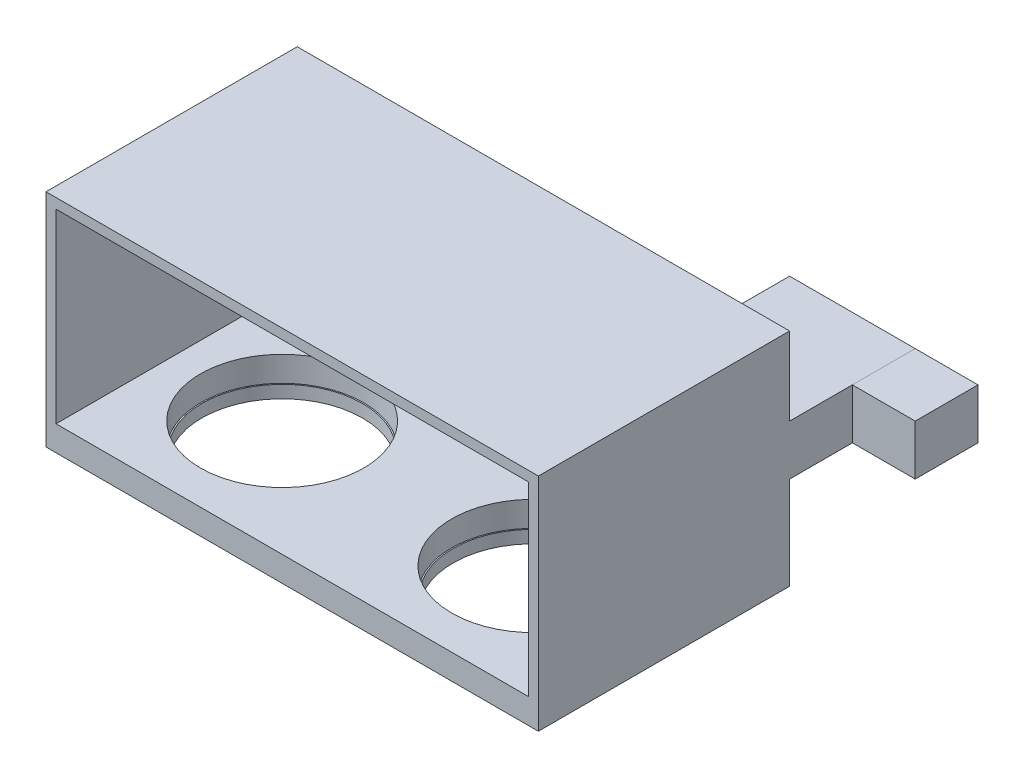
ISO-10303-21;
HEADER;
FILE_DESCRIPTION(('STEP AP214'),'2;1');
FILE_NAME('part.step','',(''),(''),'','','');
FILE_SCHEMA(('AUTOMOTIVE_DESIGN { 1 0 10303 214 1 1 1 1 }'));
ENDSEC;
DATA;
#1=APPLICATION_CONTEXT('core data for automotive mechanical design processes');
#2=APPLICATION_PROTOCOL_DEFINITION('international standard','automotive_design',2000,#1);
#3=PRODUCT_CONTEXT('',#1,'mechanical');
#4=PRODUCT('Part','Part','',(#3));
#5=PRODUCT_RELATED_PRODUCT_CATEGORY('part','',(#4));
#6=PRODUCT_DEFINITION_FORMATION('','',#4);
#7=PRODUCT_DEFINITION_CONTEXT('part definition',#1,'design');
#8=PRODUCT_DEFINITION('design','',#6,#7);
#9=PRODUCT_DEFINITION_SHAPE('','',#8);
#10=(LENGTH_UNIT() NAMED_UNIT(*) SI_UNIT(.MILLI.,.METRE.));
#11=(NAMED_UNIT(*) PLANE_ANGLE_UNIT() SI_UNIT($,.RADIAN.));
#12=(NAMED_UNIT(*) SI_UNIT($,.STERADIAN.) SOLID_ANGLE_UNIT());
#13=UNCERTAINTY_MEASURE_WITH_UNIT(LENGTH_MEASURE(1.E-05),#10,'distance_accuracy_value','');
#14=(GEOMETRIC_REPRESENTATION_CONTEXT(3) GLOBAL_UNCERTAINTY_ASSIGNED_CONTEXT((#13)) GLOBAL_UNIT_ASSIGNED_CONTEXT((#10,
#11,#12)) REPRESENTATION_CONTEXT('',''));
#15=CARTESIAN_POINT('',(0.,0.,0.));
#16=DIRECTION('',(0.,0.,1.));
#17=DIRECTION('',(1.,0.,0.));
#18=AXIS2_PLACEMENT_3D('',#15,#16,#17);
#19=CARTESIAN_POINT('',(0.,0.,0.));
#20=DIRECTION('',(0.,0.,-1.));
#21=DIRECTION('',(-1.,0.,0.));
#22=AXIS2_PLACEMENT_3D('',#19,#20,#21);
#23=PLANE('',#22);
#24=DIRECTION('',(0.,1.,0.));
#25=VECTOR('',#24,1.);
#26=CARTESIAN_POINT('',(23.876,-9.398,0.));
#27=LINE('',#26,#25);
#28=CARTESIAN_POINT('',(23.876,-9.398,0.));
#29=VERTEX_POINT('',#28);
#30=CARTESIAN_POINT('',(23.876,9.398,0.));
#31=VERTEX_POINT('',#30);
#32=EDGE_CURVE('E458',#29,#31,#27,.T.);
#33=ORIENTED_EDGE('',*,*,#32,.F.);
#34=DIRECTION('',(1.,0.,0.));
#35=VECTOR('',#34,1.);
#36=CARTESIAN_POINT('',(-24.892,-9.398,0.));
#37=LINE('',#36,#35);
#38=CARTESIAN_POINT('',(-23.876,-9.398,0.));
#39=VERTEX_POINT('',#38);
#40=EDGE_CURVE('E277',#39,#29,#37,.T.);
#41=ORIENTED_EDGE('',*,*,#40,.F.);
#42=DIRECTION('',(0.,-1.,0.));
#43=VECTOR('',#42,1.);
#44=CARTESIAN_POINT('',(-23.876,-9.398,0.));
#45=LINE('',#44,#43);
#46=CARTESIAN_POINT('',(-23.876,9.398,0.));
#47=VERTEX_POINT('',#46);
#48=EDGE_CURVE('E442',#47,#39,#45,.T.);
#49=ORIENTED_EDGE('',*,*,#48,.F.);
#50=DIRECTION('',(-1.,0.,0.));
#51=VECTOR('',#50,1.);
#52=CARTESIAN_POINT('',(-24.892,9.398,0.));
#53=LINE('',#52,#51);
#54=EDGE_CURVE('E281',#31,#47,#53,.T.);
#55=ORIENTED_EDGE('',*,*,#54,.F.);
#56=EDGE_LOOP('',(#33,#41,#49,#55));
#57=FACE_BOUND('',#56,.T.);
#58=DIRECTION('',(1.,0.,0.));
#59=VECTOR('',#58,1.);
#60=CARTESIAN_POINT('',(-24.892,10.414,0.));
#61=LINE('',#60,#59);
#62=CARTESIAN_POINT('',(-24.892,10.414,0.));
#63=VERTEX_POINT('',#62);
#64=CARTESIAN_POINT('',(24.892,10.414,0.));
#65=VERTEX_POINT('',#64);
#66=EDGE_CURVE('E171',#63,#65,#61,.T.);
#67=ORIENTED_EDGE('',*,*,#66,.F.);
#68=DIRECTION('',(0.,-1.,0.));
#69=VECTOR('',#68,1.);
#70=CARTESIAN_POINT('',(-24.892,-11.938,0.));
#71=LINE('',#70,#69);
#72=CARTESIAN_POINT('',(-24.892,-11.938,0.));
#73=VERTEX_POINT('',#72);
#74=EDGE_CURVE('E181',#63,#73,#71,.T.);
#75=ORIENTED_EDGE('',*,*,#74,.T.);
#76=DIRECTION('',(1.,0.,0.));
#77=VECTOR('',#76,1.);
#78=CARTESIAN_POINT('',(-24.892,-11.938,0.));
#79=LINE('',#78,#77);
#80=CARTESIAN_POINT('',(24.892,-11.938,0.));
#81=VERTEX_POINT('',#80);
#82=EDGE_CURVE('E192',#73,#81,#79,.T.);
#83=ORIENTED_EDGE('',*,*,#82,.T.);
#84=DIRECTION('',(0.,1.,0.));
#85=VECTOR('',#84,1.);
#86=CARTESIAN_POINT('',(24.892,-11.938,0.));
#87=LINE('',#86,#85);
#88=EDGE_CURVE('E184',#81,#65,#87,.T.);
#89=ORIENTED_EDGE('',*,*,#88,.T.);
#90=EDGE_LOOP('',(#67,#75,#83,#89));
#91=FACE_BOUND('',#90,.T.);
#92=ADVANCED_FACE('F40',(#57,#91),#23,.F.);
#93=CARTESIAN_POINT('',(24.892,-11.938,-25.4));
#94=DIRECTION('',(1.,0.,0.));
#95=DIRECTION('',(0.,0.,-1.));
#96=AXIS2_PLACEMENT_3D('',#93,#94,#95);
#97=PLANE('',#96);
#98=DIRECTION('',(0.,1.,0.));
#99=VECTOR('',#98,1.);
#100=CARTESIAN_POINT('',(24.892,-11.938,-25.4));
#101=LINE('',#100,#99);
#102=CARTESIAN_POINT('',(24.892,2.52287632805418,-25.4));
#103=VERTEX_POINT('',#102);
#104=CARTESIAN_POINT('',(24.892,10.414,-25.4));
#105=VERTEX_POINT('',#104);
#106=EDGE_CURVE('E196',#103,#105,#101,.T.);
#107=ORIENTED_EDGE('',*,*,#106,.T.);
#108=DIRECTION('',(0.,0.,-1.));
#109=VECTOR('',#108,1.);
#110=CARTESIAN_POINT('',(24.892,10.414,-25.4));
#111=LINE('',#110,#109);
#112=EDGE_CURVE('E57',#65,#105,#111,.T.);
#113=ORIENTED_EDGE('',*,*,#112,.F.);
#114=ORIENTED_EDGE('',*,*,#88,.F.);
#115=DIRECTION('',(0.,0.,1.));
#116=VECTOR('',#115,1.);
#117=CARTESIAN_POINT('',(24.892,-11.938,-25.4));
#118=LINE('',#117,#116);
#119=CARTESIAN_POINT('',(24.892,-11.938,-25.4));
#120=VERTEX_POINT('',#119);
#121=EDGE_CURVE('E202',#120,#81,#118,.T.);
#122=ORIENTED_EDGE('',*,*,#121,.F.);
#123=CARTESIAN_POINT('',(24.892,-2.55712367194582,-25.4));
#124=VERTEX_POINT('',#123);
#125=EDGE_CURVE('E270',#120,#124,#101,.T.);
#126=ORIENTED_EDGE('',*,*,#125,.T.);
#127=DIRECTION('',(0.,0.,1.));
#128=VECTOR('',#127,1.);
#129=CARTESIAN_POINT('',(24.892,-2.55712367194582,-38.1));
#130=LINE('',#129,#128);
#131=CARTESIAN_POINT('',(24.892,-2.55712367194582,-31.75));
#132=VERTEX_POINT('',#131);
#133=EDGE_CURVE('E370',#132,#124,#130,.T.);
#134=ORIENTED_EDGE('',*,*,#133,.F.);
#135=DIRECTION('',(0.,-1.,0.));
#136=VECTOR('',#135,1.);
#137=CARTESIAN_POINT('',(24.892,2.52287632805417,-31.75));
#138=LINE('',#137,#136);
#139=CARTESIAN_POINT('',(24.892,2.52287632805418,-31.75));
#140=VERTEX_POINT('',#139);
#141=EDGE_CURVE('E65',#140,#132,#138,.T.);
#142=ORIENTED_EDGE('',*,*,#141,.F.);
#143=DIRECTION('',(0.,0.,1.));
#144=VECTOR('',#143,1.);
#145=CARTESIAN_POINT('',(24.892,2.52287632805418,-38.1));
#146=LINE('',#145,#144);
#147=EDGE_CURVE('E369',#140,#103,#146,.T.);
#148=ORIENTED_EDGE('',*,*,#147,.T.);
#149=EDGE_LOOP('',(#107,#113,#114,#122,#126,#134,#142,#148));
#150=FACE_BOUND('',#149,.T.);
#151=ADVANCED_FACE('F230',(#150),#97,.T.);
#152=CARTESIAN_POINT('',(-24.892,-11.938,-25.4));
#153=DIRECTION('',(-1.,0.,0.));
#154=DIRECTION('',(0.,0.,1.));
#155=AXIS2_PLACEMENT_3D('',#152,#153,#154);
#156=PLANE('',#155);
#157=ORIENTED_EDGE('',*,*,#74,.F.);
#158=DIRECTION('',(0.,0.,1.));
#159=VECTOR('',#158,1.);
#160=CARTESIAN_POINT('',(-24.892,10.414,-25.4));
#161=LINE('',#160,#159);
#162=CARTESIAN_POINT('',(-24.892,10.414,-25.4));
#163=VERTEX_POINT('',#162);
#164=EDGE_CURVE('E168',#163,#63,#161,.T.);
#165=ORIENTED_EDGE('',*,*,#164,.F.);
#166=DIRECTION('',(0.,-1.,0.));
#167=VECTOR('',#166,1.);
#168=CARTESIAN_POINT('',(-24.892,-11.938,-25.4));
#169=LINE('',#168,#167);
#170=CARTESIAN_POINT('',(-24.892,-11.938,-25.4));
#171=VERTEX_POINT('',#170);
#172=EDGE_CURVE('E264',#163,#171,#169,.T.);
#173=ORIENTED_EDGE('',*,*,#172,.T.);
#174=DIRECTION('',(0.,0.,1.));
#175=VECTOR('',#174,1.);
#176=CARTESIAN_POINT('',(-24.892,-11.938,-25.4));
#177=LINE('',#176,#175);
#178=EDGE_CURVE('E189',#171,#73,#177,.T.);
#179=ORIENTED_EDGE('',*,*,#178,.T.);
#180=EDGE_LOOP('',(#157,#165,#173,#179));
#181=FACE_BOUND('',#180,.T.);
#182=ADVANCED_FACE('F187',(#181),#156,.T.);
#183=CARTESIAN_POINT('',(0.,0.,-25.4));
#184=DIRECTION('',(0.,0.,-1.));
#185=DIRECTION('',(-1.,0.,0.));
#186=AXIS2_PLACEMENT_3D('',#183,#184,#185);
#187=PLANE('',#186);
#188=DIRECTION('',(0.,-1.,0.));
#189=VECTOR('',#188,1.);
#190=CARTESIAN_POINT('',(-5.842,-8.382,-25.4));
#191=LINE('',#190,#189);
#192=CARTESIAN_POINT('',(-5.842,9.398,-25.4));
#193=VERTEX_POINT('',#192);
#194=CARTESIAN_POINT('',(-5.842,-8.382,-25.4));
#195=VERTEX_POINT('',#194);
#196=EDGE_CURVE('E262',#193,#195,#191,.T.);
#197=ORIENTED_EDGE('',*,*,#196,.T.);
#198=DIRECTION('',(1.,0.,0.));
#199=VECTOR('',#198,1.);
#200=CARTESIAN_POINT('',(-5.842,-8.382,-25.4));
#201=LINE('',#200,#199);
#202=CARTESIAN_POINT('',(5.84199999999999,-8.382,-25.4));
#203=VERTEX_POINT('',#202);
#204=EDGE_CURVE('E295',#195,#203,#201,.T.);
#205=ORIENTED_EDGE('',*,*,#204,.T.);
#206=DIRECTION('',(0.,1.,0.));
#207=VECTOR('',#206,1.);
#208=CARTESIAN_POINT('',(5.84199999999999,-8.382,-25.4));
#209=LINE('',#208,#207);
#210=CARTESIAN_POINT('',(5.84199999999999,9.398,-25.4));
#211=VERTEX_POINT('',#210);
#212=EDGE_CURVE('E330',#203,#211,#209,.T.);
#213=ORIENTED_EDGE('',*,*,#212,.T.);
#214=DIRECTION('',(-1.,0.,0.));
#215=VECTOR('',#214,1.);
#216=CARTESIAN_POINT('',(-5.842,9.398,-25.4));
#217=LINE('',#216,#215);
#218=EDGE_CURVE('E327',#211,#193,#217,.T.);
#219=ORIENTED_EDGE('',*,*,#218,.T.);
#220=EDGE_LOOP('',(#197,#205,#213,#219));
#221=FACE_BOUND('',#220,.T.);
#222=ORIENTED_EDGE('',*,*,#172,.F.);
#223=DIRECTION('',(-1.,0.,0.));
#224=VECTOR('',#223,1.);
#225=CARTESIAN_POINT('',(-24.892,10.414,-25.4));
#226=LINE('',#225,#224);
#227=EDGE_CURVE('E172',#105,#163,#226,.T.);
#228=ORIENTED_EDGE('',*,*,#227,.F.);
#229=ORIENTED_EDGE('',*,*,#106,.F.);
#230=DIRECTION('',(0.999999862908777,0.000523624318179764,0.));
#231=VECTOR('',#230,1.);
#232=CARTESIAN_POINT('',(12.192,2.51622629830163,-25.4));
#233=LINE('',#232,#231);
#234=CARTESIAN_POINT('',(12.192,2.51622629830163,-25.4));
#235=VERTEX_POINT('',#234);
#236=EDGE_CURVE('E391',#235,#103,#233,.T.);
#237=ORIENTED_EDGE('',*,*,#236,.F.);
#238=DIRECTION('',(0.,1.,0.));
#239=VECTOR('',#238,1.);
#240=CARTESIAN_POINT('',(12.192,-2.55712367194582,-25.4));
#241=LINE('',#240,#239);
#242=CARTESIAN_POINT('',(12.192,-2.55712367194582,-25.4));
#243=VERTEX_POINT('',#242);
#244=EDGE_CURVE('E382',#243,#235,#241,.T.);
#245=ORIENTED_EDGE('',*,*,#244,.F.);
#246=DIRECTION('',(-1.,0.,0.));
#247=VECTOR('',#246,1.);
#248=CARTESIAN_POINT('',(24.892,-2.55712367194582,-25.4));
#249=LINE('',#248,#247);
#250=EDGE_CURVE('E387',#124,#243,#249,.T.);
#251=ORIENTED_EDGE('',*,*,#250,.F.);
#252=ORIENTED_EDGE('',*,*,#125,.F.);
#253=DIRECTION('',(1.,0.,0.));
#254=VECTOR('',#253,1.);
#255=CARTESIAN_POINT('',(-24.892,-11.938,-25.4));
#256=LINE('',#255,#254);
#257=EDGE_CURVE('E206',#171,#120,#256,.T.);
#258=ORIENTED_EDGE('',*,*,#257,.F.);
#259=EDGE_LOOP('',(#222,#228,#229,#237,#245,#251,#252,#258));
#260=FACE_BOUND('',#259,.T.);
#261=ADVANCED_FACE('F240',(#221,#260),#187,.T.);
#262=CARTESIAN_POINT('',(0.,0.,-22.86));
#263=DIRECTION('',(0.,0.,-1.));
#264=DIRECTION('',(-1.,0.,0.));
#265=AXIS2_PLACEMENT_3D('',#262,#263,#264);
#266=PLANE('',#265);
#267=DIRECTION('',(0.,-1.,0.));
#268=VECTOR('',#267,1.);
#269=CARTESIAN_POINT('',(-5.842,-8.382,-22.86));
#270=LINE('',#269,#268);
#271=CARTESIAN_POINT('',(-5.842,9.398,-22.86));
#272=VERTEX_POINT('',#271);
#273=CARTESIAN_POINT('',(-5.842,-8.382,-22.86));
#274=VERTEX_POINT('',#273);
#275=EDGE_CURVE('E321',#272,#274,#270,.T.);
#276=ORIENTED_EDGE('',*,*,#275,.F.);
#277=DIRECTION('',(-1.,0.,0.));
#278=VECTOR('',#277,1.);
#279=CARTESIAN_POINT('',(-24.892,9.398,-22.86));
#280=LINE('',#279,#278);
#281=CARTESIAN_POINT('',(-23.876,9.398,-22.86));
#282=VERTEX_POINT('',#281);
#283=EDGE_CURVE('E280',#272,#282,#280,.T.);
#284=ORIENTED_EDGE('',*,*,#283,.T.);
#285=DIRECTION('',(0.,1.,0.));
#286=VECTOR('',#285,1.);
#287=CARTESIAN_POINT('',(-23.876,-9.398,-22.86));
#288=LINE('',#287,#286);
#289=CARTESIAN_POINT('',(-23.876,-9.398,-22.86));
#290=VERTEX_POINT('',#289);
#291=EDGE_CURVE('E434',#290,#282,#288,.T.);
#292=ORIENTED_EDGE('',*,*,#291,.F.);
#293=DIRECTION('',(1.,0.,0.));
#294=VECTOR('',#293,1.);
#295=CARTESIAN_POINT('',(-24.892,-9.398,-22.86));
#296=LINE('',#295,#294);
#297=CARTESIAN_POINT('',(23.876,-9.398,-22.86));
#298=VERTEX_POINT('',#297);
#299=EDGE_CURVE('E198',#290,#298,#296,.T.);
#300=ORIENTED_EDGE('',*,*,#299,.T.);
#301=DIRECTION('',(0.,-1.,0.));
#302=VECTOR('',#301,1.);
#303=CARTESIAN_POINT('',(23.876,-9.398,-22.86));
#304=LINE('',#303,#302);
#305=CARTESIAN_POINT('',(23.876,9.398,-22.86));
#306=VERTEX_POINT('',#305);
#307=EDGE_CURVE('E450',#306,#298,#304,.T.);
#308=ORIENTED_EDGE('',*,*,#307,.F.);
#309=CARTESIAN_POINT('',(5.84199999999999,9.398,-22.86));
#310=VERTEX_POINT('',#309);
#311=EDGE_CURVE('E285',#306,#310,#280,.T.);
#312=ORIENTED_EDGE('',*,*,#311,.T.);
#313=DIRECTION('',(0.,1.,0.));
#314=VECTOR('',#313,1.);
#315=CARTESIAN_POINT('',(5.84199999999999,-8.382,-22.86));
#316=LINE('',#315,#314);
#317=CARTESIAN_POINT('',(5.84199999999999,-8.382,-22.86));
#318=VERTEX_POINT('',#317);
#319=EDGE_CURVE('E306',#318,#310,#316,.T.);
#320=ORIENTED_EDGE('',*,*,#319,.F.);
#321=DIRECTION('',(1.,0.,0.));
#322=VECTOR('',#321,1.);
#323=CARTESIAN_POINT('',(-5.842,-8.382,-22.86));
#324=LINE('',#323,#322);
#325=EDGE_CURVE('E318',#274,#318,#324,.T.);
#326=ORIENTED_EDGE('',*,*,#325,.F.);
#327=EDGE_LOOP('',(#276,#284,#292,#300,#308,#312,#320,#326));
#328=FACE_BOUND('',#327,.T.);
#329=ADVANCED_FACE('F246',(#328),#266,.F.);
#330=CARTESIAN_POINT('',(-24.892,-11.938,-25.4));
#331=DIRECTION('',(0.,-1.,0.));
#332=DIRECTION('',(0.,0.,-1.));
#333=AXIS2_PLACEMENT_3D('',#330,#331,#332);
#334=PLANE('',#333);
#335=CARTESIAN_POINT('',(12.7,-11.938,-11.684));
#336=DIRECTION('',(0.,-1.,0.));
#337=DIRECTION('',(0.,0.,-1.));
#338=AXIS2_PLACEMENT_3D('',#335,#336,#337);
#339=CIRCLE('',#338,10.541);
#340=CARTESIAN_POINT('',(12.7,-11.938,-22.225));
#341=VERTEX_POINT('',#340);
#342=EDGE_CURVE('E354',#341,#341,#339,.T.);
#343=ORIENTED_EDGE('',*,*,#342,.F.);
#344=EDGE_LOOP('',(#343));
#345=FACE_BOUND('',#344,.T.);
#346=CARTESIAN_POINT('',(-12.7,-11.938,-11.684));
#347=DIRECTION('',(0.,-1.,0.));
#348=DIRECTION('',(0.,0.,-1.));
#349=AXIS2_PLACEMENT_3D('',#346,#347,#348);
#350=CIRCLE('',#349,10.541);
#351=CARTESIAN_POINT('',(-12.7,-11.938,-22.225));
#352=VERTEX_POINT('',#351);
#353=EDGE_CURVE('E338',#352,#352,#350,.T.);
#354=ORIENTED_EDGE('',*,*,#353,.F.);
#355=EDGE_LOOP('',(#354));
#356=FACE_BOUND('',#355,.T.);
#357=ORIENTED_EDGE('',*,*,#82,.F.);
#358=ORIENTED_EDGE('',*,*,#178,.F.);
#359=ORIENTED_EDGE('',*,*,#257,.T.);
#360=ORIENTED_EDGE('',*,*,#121,.T.);
#361=EDGE_LOOP('',(#357,#358,#359,#360));
#362=FACE_BOUND('',#361,.T.);
#363=ADVANCED_FACE('F242',(#345,#356,#362),#334,.T.);
#364=CARTESIAN_POINT('',(-24.892,-9.398,-25.4));
#365=DIRECTION('',(0.,-1.,0.));
#366=DIRECTION('',(0.,0.,-1.));
#367=AXIS2_PLACEMENT_3D('',#364,#365,#366);
#368=PLANE('',#367);
#369=CARTESIAN_POINT('',(-12.7,-9.398,-11.684));
#370=DIRECTION('',(0.,-1.,0.));
#371=DIRECTION('',(0.,0.,-1.));
#372=AXIS2_PLACEMENT_3D('',#369,#370,#371);
#373=CIRCLE('',#372,8.255);
#374=CARTESIAN_POINT('',(-12.7,-9.398,-19.939));
#375=VERTEX_POINT('',#374);
#376=EDGE_CURVE('E284',#375,#375,#373,.F.);
#377=ORIENTED_EDGE('',*,*,#376,.F.);
#378=EDGE_LOOP('',(#377));
#379=FACE_BOUND('',#378,.T.);
#380=CARTESIAN_POINT('',(12.7,-9.398,-11.684));
#381=DIRECTION('',(0.,-1.,0.));
#382=DIRECTION('',(0.,0.,-1.));
#383=AXIS2_PLACEMENT_3D('',#380,#381,#382);
#384=CIRCLE('',#383,8.255);
#385=CARTESIAN_POINT('',(12.7,-9.398,-19.939));
#386=VERTEX_POINT('',#385);
#387=EDGE_CURVE('E291',#386,#386,#384,.F.);
#388=ORIENTED_EDGE('',*,*,#387,.F.);
#389=EDGE_LOOP('',(#388));
#390=FACE_BOUND('',#389,.T.);
#391=ORIENTED_EDGE('',*,*,#40,.T.);
#392=DIRECTION('',(0.,0.,1.));
#393=VECTOR('',#392,1.);
#394=CARTESIAN_POINT('',(23.876,-9.398,0.));
#395=LINE('',#394,#393);
#396=EDGE_CURVE('E446',#298,#29,#395,.T.);
#397=ORIENTED_EDGE('',*,*,#396,.F.);
#398=ORIENTED_EDGE('',*,*,#299,.F.);
#399=DIRECTION('',(0.,0.,-1.));
#400=VECTOR('',#399,1.);
#401=CARTESIAN_POINT('',(-23.876,-9.398,0.));
#402=LINE('',#401,#400);
#403=EDGE_CURVE('E438',#39,#290,#402,.T.);
#404=ORIENTED_EDGE('',*,*,#403,.F.);
#405=EDGE_LOOP('',(#391,#397,#398,#404));
#406=FACE_BOUND('',#405,.T.);
#407=ADVANCED_FACE('F245',(#379,#390,#406),#368,.F.);
#408=CARTESIAN_POINT('',(-24.892,9.398,-25.4));
#409=DIRECTION('',(0.,1.,0.));
#410=DIRECTION('',(0.,0.,1.));
#411=AXIS2_PLACEMENT_3D('',#408,#409,#410);
#412=PLANE('',#411);
#413=ORIENTED_EDGE('',*,*,#54,.T.);
#414=DIRECTION('',(0.,0.,1.));
#415=VECTOR('',#414,1.);
#416=CARTESIAN_POINT('',(-23.876,9.398,0.));
#417=LINE('',#416,#415);
#418=EDGE_CURVE('E418',#282,#47,#417,.T.);
#419=ORIENTED_EDGE('',*,*,#418,.F.);
#420=ORIENTED_EDGE('',*,*,#283,.F.);
#421=DIRECTION('',(0.,0.,1.));
#422=VECTOR('',#421,1.);
#423=CARTESIAN_POINT('',(-5.842,9.398,-25.401));
#424=LINE('',#423,#422);
#425=EDGE_CURVE('E301',#193,#272,#424,.T.);
#426=ORIENTED_EDGE('',*,*,#425,.F.);
#427=ORIENTED_EDGE('',*,*,#218,.F.);
#428=DIRECTION('',(0.,0.,1.));
#429=VECTOR('',#428,1.);
#430=CARTESIAN_POINT('',(5.84199999999999,9.398,-25.401));
#431=LINE('',#430,#429);
#432=EDGE_CURVE('E310',#211,#310,#431,.T.);
#433=ORIENTED_EDGE('',*,*,#432,.T.);
#434=ORIENTED_EDGE('',*,*,#311,.F.);
#435=DIRECTION('',(0.,0.,-1.));
#436=VECTOR('',#435,1.);
#437=CARTESIAN_POINT('',(23.876,9.398,0.));
#438=LINE('',#437,#436);
#439=EDGE_CURVE('E454',#31,#306,#438,.T.);
#440=ORIENTED_EDGE('',*,*,#439,.F.);
#441=EDGE_LOOP('',(#413,#419,#420,#426,#427,#433,#434,#440));
#442=FACE_BOUND('',#441,.T.);
#443=ADVANCED_FACE('F477',(#442),#412,.F.);
#444=CARTESIAN_POINT('',(12.7,11.939,-11.684));
#445=DIRECTION('',(0.,-1.,0.));
#446=DIRECTION('',(0.,0.,-1.));
#447=AXIS2_PLACEMENT_3D('',#444,#445,#446);
#448=CYLINDRICAL_SURFACE('',#447,8.255);
#449=CARTESIAN_POINT('',(12.7,-11.938,-11.684));
#450=DIRECTION('',(0.,-1.,0.));
#451=DIRECTION('',(0.,0.,-1.));
#452=AXIS2_PLACEMENT_3D('',#449,#450,#451);
#453=CIRCLE('',#452,8.255);
#454=CARTESIAN_POINT('',(12.7,-11.938,-19.939));
#455=VERTEX_POINT('',#454);
#456=EDGE_CURVE('E347',#455,#455,#453,.F.);
#457=ORIENTED_EDGE('',*,*,#456,.F.);
#458=EDGE_LOOP('',(#457));
#459=FACE_BOUND('',#458,.T.);
#460=ORIENTED_EDGE('',*,*,#387,.T.);
#461=EDGE_LOOP('',(#460));
#462=FACE_BOUND('',#461,.T.);
#463=ADVANCED_FACE('F500',(#459,#462),#448,.F.);
#464=CARTESIAN_POINT('',(-12.7,11.939,-11.684));
#465=DIRECTION('',(0.,-1.,0.));
#466=DIRECTION('',(0.,0.,-1.));
#467=AXIS2_PLACEMENT_3D('',#464,#465,#466);
#468=CYLINDRICAL_SURFACE('',#467,8.255);
#469=CARTESIAN_POINT('',(-12.7,-11.938,-11.684));
#470=DIRECTION('',(0.,-1.,0.));
#471=DIRECTION('',(0.,0.,-1.));
#472=AXIS2_PLACEMENT_3D('',#469,#470,#471);
#473=CIRCLE('',#472,8.255);
#474=CARTESIAN_POINT('',(-12.7,-11.938,-19.939));
#475=VERTEX_POINT('',#474);
#476=EDGE_CURVE('E334',#475,#475,#473,.F.);
#477=ORIENTED_EDGE('',*,*,#476,.F.);
#478=EDGE_LOOP('',(#477));
#479=FACE_BOUND('',#478,.T.);
#480=ORIENTED_EDGE('',*,*,#376,.T.);
#481=EDGE_LOOP('',(#480));
#482=FACE_BOUND('',#481,.T.);
#483=ADVANCED_FACE('F493',(#479,#482),#468,.F.);
#484=CARTESIAN_POINT('',(-5.842,-8.382,-25.401));
#485=DIRECTION('',(-1.,0.,0.));
#486=DIRECTION('',(0.,0.,1.));
#487=AXIS2_PLACEMENT_3D('',#484,#485,#486);
#488=PLANE('',#487);
#489=ORIENTED_EDGE('',*,*,#425,.T.);
#490=ORIENTED_EDGE('',*,*,#275,.T.);
#491=DIRECTION('',(0.,0.,1.));
#492=VECTOR('',#491,1.);
#493=CARTESIAN_POINT('',(-5.842,-8.382,-25.401));
#494=LINE('',#493,#492);
#495=EDGE_CURVE('E302',#195,#274,#494,.T.);
#496=ORIENTED_EDGE('',*,*,#495,.F.);
#497=ORIENTED_EDGE('',*,*,#196,.F.);
#498=EDGE_LOOP('',(#489,#490,#496,#497));
#499=FACE_BOUND('',#498,.T.);
#500=ADVANCED_FACE('F491',(#499),#488,.F.);
#501=CARTESIAN_POINT('',(5.84199999999999,-8.382,-25.401));
#502=DIRECTION('',(1.,0.,0.));
#503=DIRECTION('',(0.,0.,-1.));
#504=AXIS2_PLACEMENT_3D('',#501,#502,#503);
#505=PLANE('',#504);
#506=DIRECTION('',(0.,0.,1.));
#507=VECTOR('',#506,1.);
#508=CARTESIAN_POINT('',(5.84199999999999,-8.382,-25.401));
#509=LINE('',#508,#507);
#510=EDGE_CURVE('E305',#203,#318,#509,.T.);
#511=ORIENTED_EDGE('',*,*,#510,.T.);
#512=ORIENTED_EDGE('',*,*,#319,.T.);
#513=ORIENTED_EDGE('',*,*,#432,.F.);
#514=ORIENTED_EDGE('',*,*,#212,.F.);
#515=EDGE_LOOP('',(#511,#512,#513,#514));
#516=FACE_BOUND('',#515,.T.);
#517=ADVANCED_FACE('F486',(#516),#505,.F.);
#518=CARTESIAN_POINT('',(-5.842,-8.382,-25.401));
#519=DIRECTION('',(0.,-1.,0.));
#520=DIRECTION('',(0.,0.,-1.));
#521=AXIS2_PLACEMENT_3D('',#518,#519,#520);
#522=PLANE('',#521);
#523=ORIENTED_EDGE('',*,*,#495,.T.);
#524=ORIENTED_EDGE('',*,*,#325,.T.);
#525=ORIENTED_EDGE('',*,*,#510,.F.);
#526=ORIENTED_EDGE('',*,*,#204,.F.);
#527=EDGE_LOOP('',(#523,#524,#525,#526));
#528=FACE_BOUND('',#527,.T.);
#529=ADVANCED_FACE('F488',(#528),#522,.F.);
#530=CARTESIAN_POINT('',(-12.7,-11.938,-11.684));
#531=DIRECTION('',(0.,-1.,0.));
#532=DIRECTION('',(0.,0.,-1.));
#533=AXIS2_PLACEMENT_3D('',#530,#531,#532);
#534=PLANE('',#533);
#535=CARTESIAN_POINT('',(-12.7,-11.938,-11.684));
#536=DIRECTION('',(0.,-1.,0.));
#537=DIRECTION('',(0.,0.,-1.));
#538=AXIS2_PLACEMENT_3D('',#535,#536,#537);
#539=CIRCLE('',#538,8.128);
#540=CARTESIAN_POINT('',(-12.7,-11.938,-19.812));
#541=VERTEX_POINT('',#540);
#542=EDGE_CURVE('E343',#541,#541,#539,.T.);
#543=ORIENTED_EDGE('',*,*,#542,.T.);
#544=EDGE_LOOP('',(#543));
#545=FACE_BOUND('',#544,.T.);
#546=ORIENTED_EDGE('',*,*,#476,.T.);
#547=EDGE_LOOP('',(#546));
#548=FACE_BOUND('',#547,.T.);
#549=ADVANCED_FACE('F546',(#545,#548),#534,.F.);
#550=CARTESIAN_POINT('',(-12.7,-13.208,-11.684));
#551=DIRECTION('',(0.,-1.,0.));
#552=DIRECTION('',(0.,0.,-1.));
#553=AXIS2_PLACEMENT_3D('',#550,#551,#552);
#554=PLANE('',#553);
#555=CARTESIAN_POINT('',(-12.7,-13.208,-11.684));
#556=DIRECTION('',(0.,-1.,0.));
#557=DIRECTION('',(0.,0.,-1.));
#558=AXIS2_PLACEMENT_3D('',#555,#556,#557);
#559=CIRCLE('',#558,9.27100000000001);
#560=CARTESIAN_POINT('',(-12.7,-13.208,-20.955));
#561=VERTEX_POINT('',#560);
#562=EDGE_CURVE('E11',#561,#561,#559,.T.);
#563=ORIENTED_EDGE('',*,*,#562,.T.);
#564=EDGE_LOOP('',(#563));
#565=FACE_BOUND('',#564,.T.);
#566=CARTESIAN_POINT('',(-12.7,-13.208,-11.684));
#567=DIRECTION('',(0.,-1.,0.));
#568=DIRECTION('',(0.,0.,-1.));
#569=AXIS2_PLACEMENT_3D('',#566,#567,#568);
#570=CIRCLE('',#569,8.128);
#571=CARTESIAN_POINT('',(-12.7,-13.208,-19.812));
#572=VERTEX_POINT('',#571);
#573=EDGE_CURVE('E342',#572,#572,#570,.T.);
#574=ORIENTED_EDGE('',*,*,#573,.F.);
#575=EDGE_LOOP('',(#574));
#576=FACE_BOUND('',#575,.T.);
#577=ADVANCED_FACE('F561',(#565,#576),#554,.T.);
#578=CARTESIAN_POINT('',(-12.7,-13.208,-11.684));
#579=DIRECTION('',(0.,1.,0.));
#580=DIRECTION('',(0.,0.,1.));
#581=AXIS2_PLACEMENT_3D('',#578,#579,#580);
#582=CYLINDRICAL_SURFACE('',#581,8.128);
#583=ORIENTED_EDGE('',*,*,#573,.T.);
#584=EDGE_LOOP('',(#583));
#585=FACE_BOUND('',#584,.T.);
#586=ORIENTED_EDGE('',*,*,#542,.F.);
#587=EDGE_LOOP('',(#586));
#588=FACE_BOUND('',#587,.T.);
#589=ADVANCED_FACE('F569',(#585,#588),#582,.F.);
#590=CARTESIAN_POINT('',(12.7,-11.938,-11.684));
#591=DIRECTION('',(0.,-1.,0.));
#592=DIRECTION('',(0.,0.,-1.));
#593=AXIS2_PLACEMENT_3D('',#590,#591,#592);
#594=PLANE('',#593);
#595=CARTESIAN_POINT('',(12.7,-11.938,-11.684));
#596=DIRECTION('',(0.,-1.,0.));
#597=DIRECTION('',(0.,0.,-1.));
#598=AXIS2_PLACEMENT_3D('',#595,#596,#597);
#599=CIRCLE('',#598,8.128);
#600=CARTESIAN_POINT('',(12.7,-11.938,-19.812));
#601=VERTEX_POINT('',#600);
#602=EDGE_CURVE('E358',#601,#601,#599,.T.);
#603=ORIENTED_EDGE('',*,*,#602,.T.);
#604=EDGE_LOOP('',(#603));
#605=FACE_BOUND('',#604,.T.);
#606=ORIENTED_EDGE('',*,*,#456,.T.);
#607=EDGE_LOOP('',(#606));
#608=FACE_BOUND('',#607,.T.);
#609=ADVANCED_FACE('F574',(#605,#608),#594,.F.);
#610=CARTESIAN_POINT('',(12.7,-13.208,-11.684));
#611=DIRECTION('',(0.,-1.,0.));
#612=DIRECTION('',(0.,0.,-1.));
#613=AXIS2_PLACEMENT_3D('',#610,#611,#612);
#614=PLANE('',#613);
#615=CARTESIAN_POINT('',(12.7,-13.208,-11.684));
#616=DIRECTION('',(0.,-1.,0.));
#617=DIRECTION('',(0.,0.,-1.));
#618=AXIS2_PLACEMENT_3D('',#615,#616,#617);
#619=CIRCLE('',#618,9.27099999999999);
#620=CARTESIAN_POINT('',(12.7,-13.208,-20.955));
#621=VERTEX_POINT('',#620);
#622=EDGE_CURVE('E50',#621,#621,#619,.T.);
#623=ORIENTED_EDGE('',*,*,#622,.T.);
#624=EDGE_LOOP('',(#623));
#625=FACE_BOUND('',#624,.T.);
#626=CARTESIAN_POINT('',(12.7,-13.208,-11.684));
#627=DIRECTION('',(0.,-1.,0.));
#628=DIRECTION('',(0.,0.,-1.));
#629=AXIS2_PLACEMENT_3D('',#626,#627,#628);
#630=CIRCLE('',#629,8.128);
#631=CARTESIAN_POINT('',(12.7,-13.208,-19.812));
#632=VERTEX_POINT('',#631);
#633=EDGE_CURVE('E357',#632,#632,#630,.T.);
#634=ORIENTED_EDGE('',*,*,#633,.F.);
#635=EDGE_LOOP('',(#634));
#636=FACE_BOUND('',#635,.T.);
#637=ADVANCED_FACE('F211',(#625,#636),#614,.T.);
#638=CARTESIAN_POINT('',(12.7,-13.208,-11.684));
#639=DIRECTION('',(0.,1.,0.));
#640=DIRECTION('',(0.,0.,1.));
#641=AXIS2_PLACEMENT_3D('',#638,#639,#640);
#642=CYLINDRICAL_SURFACE('',#641,8.128);
#643=ORIENTED_EDGE('',*,*,#633,.T.);
#644=EDGE_LOOP('',(#643));
#645=FACE_BOUND('',#644,.T.);
#646=ORIENTED_EDGE('',*,*,#602,.F.);
#647=EDGE_LOOP('',(#646));
#648=FACE_BOUND('',#647,.T.);
#649=ADVANCED_FACE('F591',(#645,#648),#642,.F.);
#650=CARTESIAN_POINT('',(12.192,2.51622629830163,-38.1));
#651=DIRECTION('',(0.000523624318179764,-0.999999862908777,0.));
#652=DIRECTION('',(0.999999862908778,0.000523624318179765,0.));
#653=AXIS2_PLACEMENT_3D('',#650,#651,#652);
#654=PLANE('',#653);
#655=ORIENTED_EDGE('',*,*,#236,.T.);
#656=ORIENTED_EDGE('',*,*,#147,.F.);
#657=CARTESIAN_POINT('',(24.892,2.52287632805418,-38.1));
#658=VERTEX_POINT('',#657);
#659=EDGE_CURVE('E362',#658,#140,#146,.T.);
#660=ORIENTED_EDGE('',*,*,#659,.F.);
#661=DIRECTION('',(0.999999862908777,0.000523624318179764,0.));
#662=VECTOR('',#661,1.);
#663=CARTESIAN_POINT('',(12.192,2.51622629830163,-38.1));
#664=LINE('',#663,#662);
#665=CARTESIAN_POINT('',(12.192,2.51622629830163,-38.1));
#666=VERTEX_POINT('',#665);
#667=EDGE_CURVE('E386',#666,#658,#664,.T.);
#668=ORIENTED_EDGE('',*,*,#667,.F.);
#669=DIRECTION('',(0.,0.,1.));
#670=VECTOR('',#669,1.);
#671=CARTESIAN_POINT('',(12.192,2.51622629830163,-38.1));
#672=LINE('',#671,#670);
#673=EDGE_CURVE('E377',#666,#235,#672,.T.);
#674=ORIENTED_EDGE('',*,*,#673,.T.);
#675=EDGE_LOOP('',(#655,#656,#660,#668,#674));
#676=FACE_BOUND('',#675,.T.);
#677=ADVANCED_FACE('F596',(#676),#654,.F.);
#678=CARTESIAN_POINT('',(24.892,-2.55712367194582,-38.1));
#679=DIRECTION('',(0.,1.,0.));
#680=DIRECTION('',(0.,0.,1.));
#681=AXIS2_PLACEMENT_3D('',#678,#679,#680);
#682=PLANE('',#681);
#683=ORIENTED_EDGE('',*,*,#250,.T.);
#684=DIRECTION('',(0.,0.,1.));
#685=VECTOR('',#684,1.);
#686=CARTESIAN_POINT('',(12.192,-2.55712367194582,-38.1));
#687=LINE('',#686,#685);
#688=CARTESIAN_POINT('',(12.192,-2.55712367194582,-38.1));
#689=VERTEX_POINT('',#688);
#690=EDGE_CURVE('E373',#689,#243,#687,.T.);
#691=ORIENTED_EDGE('',*,*,#690,.F.);
#692=DIRECTION('',(-1.,0.,0.));
#693=VECTOR('',#692,1.);
#694=CARTESIAN_POINT('',(24.892,-2.55712367194582,-38.1));
#695=LINE('',#694,#693);
#696=CARTESIAN_POINT('',(31.242,-2.55712367194582,-38.1));
#697=VERTEX_POINT('',#696);
#698=EDGE_CURVE('E398',#697,#689,#695,.T.);
#699=ORIENTED_EDGE('',*,*,#698,.F.);
#700=DIRECTION('',(0.,0.,-1.));
#701=VECTOR('',#700,1.);
#702=CARTESIAN_POINT('',(31.242,-2.55712367194582,-38.1));
#703=LINE('',#702,#701);
#704=CARTESIAN_POINT('',(31.242,-2.55712367194582,-31.75));
#705=VERTEX_POINT('',#704);
#706=EDGE_CURVE('E414',#705,#697,#703,.T.);
#707=ORIENTED_EDGE('',*,*,#706,.F.);
#708=DIRECTION('',(-1.,0.,0.));
#709=VECTOR('',#708,1.);
#710=CARTESIAN_POINT('',(31.242,-2.55712367194582,-31.75));
#711=LINE('',#710,#709);
#712=EDGE_CURVE('E410',#705,#132,#711,.T.);
#713=ORIENTED_EDGE('',*,*,#712,.T.);
#714=ORIENTED_EDGE('',*,*,#133,.T.);
#715=EDGE_LOOP('',(#683,#691,#699,#707,#713,#714));
#716=FACE_BOUND('',#715,.T.);
#717=ADVANCED_FACE('F610',(#716),#682,.F.);
#718=CARTESIAN_POINT('',(12.192,-2.55712367194582,-38.1));
#719=DIRECTION('',(1.,0.,0.));
#720=DIRECTION('',(0.,0.,-1.));
#721=AXIS2_PLACEMENT_3D('',#718,#719,#720);
#722=PLANE('',#721);
#723=ORIENTED_EDGE('',*,*,#244,.T.);
#724=ORIENTED_EDGE('',*,*,#673,.F.);
#725=DIRECTION('',(0.,1.,0.));
#726=VECTOR('',#725,1.);
#727=CARTESIAN_POINT('',(12.192,-2.55712367194582,-38.1));
#728=LINE('',#727,#726);
#729=EDGE_CURVE('E381',#689,#666,#728,.T.);
#730=ORIENTED_EDGE('',*,*,#729,.F.);
#731=ORIENTED_EDGE('',*,*,#690,.T.);
#732=EDGE_LOOP('',(#723,#724,#730,#731));
#733=FACE_BOUND('',#732,.T.);
#734=ADVANCED_FACE('F604',(#733),#722,.F.);
#735=CARTESIAN_POINT('',(0.,0.,-38.1));
#736=DIRECTION('',(0.,0.,-1.));
#737=DIRECTION('',(-1.,0.,0.));
#738=AXIS2_PLACEMENT_3D('',#735,#736,#737);
#739=PLANE('',#738);
#740=ORIENTED_EDGE('',*,*,#667,.T.);
#741=DIRECTION('',(-1.,0.,0.));
#742=VECTOR('',#741,1.);
#743=CARTESIAN_POINT('',(31.242,2.52287632805418,-38.1));
#744=LINE('',#743,#742);
#745=CARTESIAN_POINT('',(31.242,2.52287632805418,-38.1));
#746=VERTEX_POINT('',#745);
#747=EDGE_CURVE('E395',#746,#658,#744,.T.);
#748=ORIENTED_EDGE('',*,*,#747,.F.);
#749=DIRECTION('',(0.,1.,0.));
#750=VECTOR('',#749,1.);
#751=CARTESIAN_POINT('',(31.242,2.52287632805418,-38.1));
#752=LINE('',#751,#750);
#753=EDGE_CURVE('E417',#697,#746,#752,.T.);
#754=ORIENTED_EDGE('',*,*,#753,.F.);
#755=ORIENTED_EDGE('',*,*,#698,.T.);
#756=ORIENTED_EDGE('',*,*,#729,.T.);
#757=EDGE_LOOP('',(#740,#748,#754,#755,#756));
#758=FACE_BOUND('',#757,.T.);
#759=ADVANCED_FACE('F609',(#758),#739,.T.);
#760=CARTESIAN_POINT('',(31.242,2.52287632805418,-38.1));
#761=DIRECTION('',(0.,-1.,0.));
#762=DIRECTION('',(0.,0.,-1.));
#763=AXIS2_PLACEMENT_3D('',#760,#761,#762);
#764=PLANE('',#763);
#765=ORIENTED_EDGE('',*,*,#659,.T.);
#766=DIRECTION('',(-1.,0.,0.));
#767=VECTOR('',#766,1.);
#768=CARTESIAN_POINT('',(31.242,2.52287632805417,-31.75));
#769=LINE('',#768,#767);
#770=CARTESIAN_POINT('',(31.242,2.52287632805417,-31.75));
#771=VERTEX_POINT('',#770);
#772=EDGE_CURVE('E406',#771,#140,#769,.T.);
#773=ORIENTED_EDGE('',*,*,#772,.F.);
#774=DIRECTION('',(0.,0.,1.));
#775=VECTOR('',#774,1.);
#776=CARTESIAN_POINT('',(31.242,2.52287632805418,-38.1));
#777=LINE('',#776,#775);
#778=EDGE_CURVE('E425',#746,#771,#777,.T.);
#779=ORIENTED_EDGE('',*,*,#778,.F.);
#780=ORIENTED_EDGE('',*,*,#747,.T.);
#781=EDGE_LOOP('',(#765,#773,#779,#780));
#782=FACE_BOUND('',#781,.T.);
#783=ADVANCED_FACE('F638',(#782),#764,.F.);
#784=CARTESIAN_POINT('',(31.242,2.52287632805417,-31.75));
#785=DIRECTION('',(0.,0.,-1.));
#786=DIRECTION('',(-1.,0.,0.));
#787=AXIS2_PLACEMENT_3D('',#784,#785,#786);
#788=PLANE('',#787);
#789=ORIENTED_EDGE('',*,*,#141,.T.);
#790=ORIENTED_EDGE('',*,*,#712,.F.);
#791=DIRECTION('',(0.,-1.,0.));
#792=VECTOR('',#791,1.);
#793=CARTESIAN_POINT('',(31.242,2.52287632805417,-31.75));
#794=LINE('',#793,#792);
#795=EDGE_CURVE('E422',#771,#705,#794,.T.);
#796=ORIENTED_EDGE('',*,*,#795,.F.);
#797=ORIENTED_EDGE('',*,*,#772,.T.);
#798=EDGE_LOOP('',(#789,#790,#796,#797));
#799=FACE_BOUND('',#798,.T.);
#800=ADVANCED_FACE('F648',(#799),#788,.F.);
#801=CARTESIAN_POINT('',(31.242,0.,0.));
#802=DIRECTION('',(-1.,0.,0.));
#803=DIRECTION('',(0.,0.,1.));
#804=AXIS2_PLACEMENT_3D('',#801,#802,#803);
#805=PLANE('',#804);
#806=ORIENTED_EDGE('',*,*,#753,.T.);
#807=ORIENTED_EDGE('',*,*,#778,.T.);
#808=ORIENTED_EDGE('',*,*,#795,.T.);
#809=ORIENTED_EDGE('',*,*,#706,.T.);
#810=EDGE_LOOP('',(#806,#807,#808,#809));
#811=FACE_BOUND('',#810,.T.);
#812=ADVANCED_FACE('F658',(#811),#805,.F.);
#813=CARTESIAN_POINT('',(-23.876,0.,0.));
#814=DIRECTION('',(-1.,0.,0.));
#815=DIRECTION('',(0.,0.,1.));
#816=AXIS2_PLACEMENT_3D('',#813,#814,#815);
#817=PLANE('',#816);
#818=ORIENTED_EDGE('',*,*,#48,.T.);
#819=ORIENTED_EDGE('',*,*,#403,.T.);
#820=ORIENTED_EDGE('',*,*,#291,.T.);
#821=ORIENTED_EDGE('',*,*,#418,.T.);
#822=EDGE_LOOP('',(#818,#819,#820,#821));
#823=FACE_BOUND('',#822,.T.);
#824=ADVANCED_FACE('F223',(#823),#817,.F.);
#825=CARTESIAN_POINT('',(23.876,0.,0.));
#826=DIRECTION('',(-1.,0.,0.));
#827=DIRECTION('',(0.,0.,1.));
#828=AXIS2_PLACEMENT_3D('',#825,#826,#827);
#829=PLANE('',#828);
#830=ORIENTED_EDGE('',*,*,#32,.T.);
#831=ORIENTED_EDGE('',*,*,#439,.T.);
#832=ORIENTED_EDGE('',*,*,#307,.T.);
#833=ORIENTED_EDGE('',*,*,#396,.T.);
#834=EDGE_LOOP('',(#830,#831,#832,#833));
#835=FACE_BOUND('',#834,.T.);
#836=ADVANCED_FACE('F216',(#835),#829,.T.);
#837=CARTESIAN_POINT('',(12.7,-13.208,-11.684));
#838=DIRECTION('',(0.,1.,0.));
#839=DIRECTION('',(0.,0.,1.));
#840=AXIS2_PLACEMENT_3D('',#837,#838,#839);
#841=CONICAL_SURFACE('',#840,9.27099999999999,0.785398163397445);
#842=ORIENTED_EDGE('',*,*,#342,.T.);
#843=EDGE_LOOP('',(#842));
#844=FACE_BOUND('',#843,.T.);
#845=ORIENTED_EDGE('',*,*,#622,.F.);
#846=EDGE_LOOP('',(#845));
#847=FACE_BOUND('',#846,.T.);
#848=ADVANCED_FACE('F214',(#844,#847),#841,.T.);
#849=CARTESIAN_POINT('',(-12.7,-13.208,-11.684));
#850=DIRECTION('',(0.,1.,0.));
#851=DIRECTION('',(0.,0.,1.));
#852=AXIS2_PLACEMENT_3D('',#849,#850,#851);
#853=CONICAL_SURFACE('',#852,9.27100000000001,0.785398163397447);
#854=ORIENTED_EDGE('',*,*,#353,.T.);
#855=EDGE_LOOP('',(#854));
#856=FACE_BOUND('',#855,.T.);
#857=ORIENTED_EDGE('',*,*,#562,.F.);
#858=EDGE_LOOP('',(#857));
#859=FACE_BOUND('',#858,.T.);
#860=ADVANCED_FACE('F43',(#856,#859),#853,.T.);
#861=CARTESIAN_POINT('',(0.,10.414,0.));
#862=DIRECTION('',(0.,1.,0.));
#863=DIRECTION('',(0.,0.,1.));
#864=AXIS2_PLACEMENT_3D('',#861,#862,#863);
#865=PLANE('',#864);
#866=ORIENTED_EDGE('',*,*,#164,.T.);
#867=ORIENTED_EDGE('',*,*,#66,.T.);
#868=ORIENTED_EDGE('',*,*,#112,.T.);
#869=ORIENTED_EDGE('',*,*,#227,.T.);
#870=EDGE_LOOP('',(#866,#867,#868,#869));
#871=FACE_BOUND('',#870,.T.);
#872=ADVANCED_FACE('F170',(#871),#865,.T.);
#873=CLOSED_SHELL('',(#92,#151,#182,#261,#329,#363,#407,#443,#463,#483,#500,#517,#529,#549,#577,
#589,#609,#637,#649,#677,#717,#734,#759,#783,#800,#812,#824,#836,#848,#860,#872));
#874=MANIFOLD_SOLID_BREP('B2',#873);
#875=ADVANCED_BREP_SHAPE_REPRESENTATION('',(#18,#874),#14);
#876=SHAPE_DEFINITION_REPRESENTATION(#9,#875);
ENDSEC;
END-ISO-10303-21;
